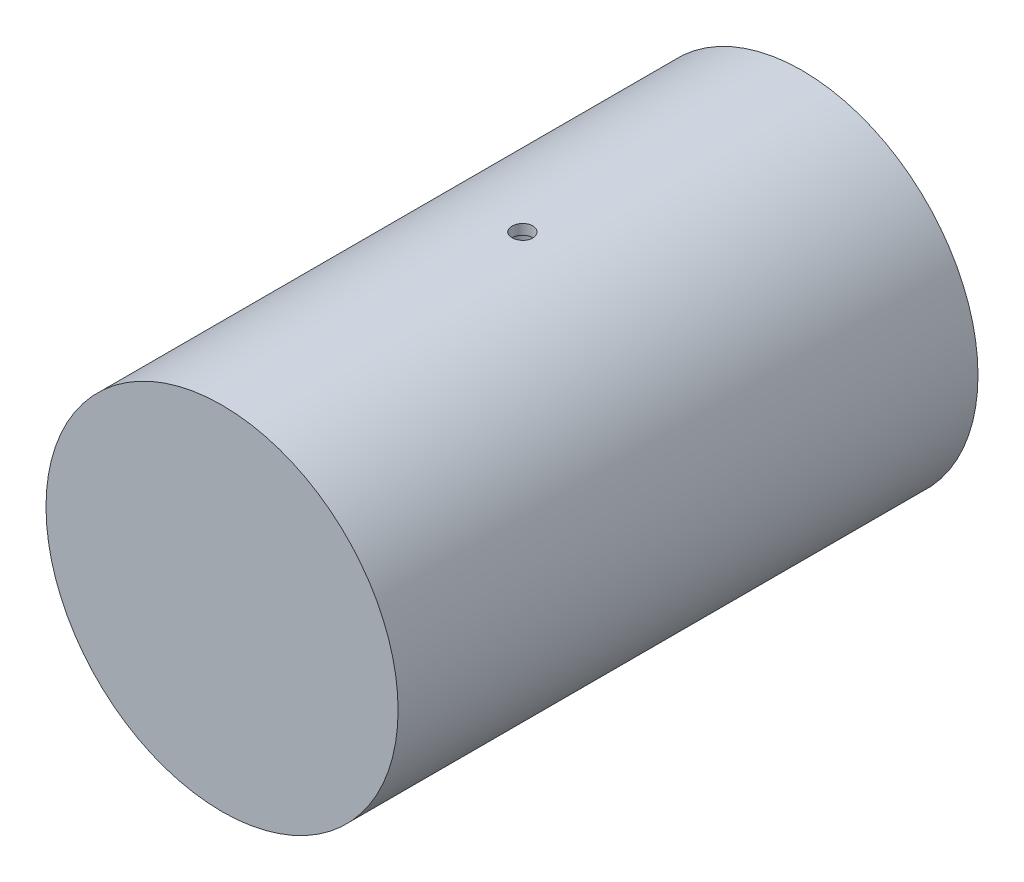
ISO-10303-21;
HEADER;
FILE_DESCRIPTION(('STEP AP214'),'2;1');
FILE_NAME('part.step','',(''),(''),'','','');
FILE_SCHEMA(('AUTOMOTIVE_DESIGN { 1 0 10303 214 1 1 1 1 }'));
ENDSEC;
DATA;
#1=APPLICATION_CONTEXT('core data for automotive mechanical design processes');
#2=APPLICATION_PROTOCOL_DEFINITION('international standard','automotive_design',2000,#1);
#3=PRODUCT_CONTEXT('',#1,'mechanical');
#4=PRODUCT('Part','Part','',(#3));
#5=PRODUCT_RELATED_PRODUCT_CATEGORY('part','',(#4));
#6=PRODUCT_DEFINITION_FORMATION('','',#4);
#7=PRODUCT_DEFINITION_CONTEXT('part definition',#1,'design');
#8=PRODUCT_DEFINITION('design','',#6,#7);
#9=PRODUCT_DEFINITION_SHAPE('','',#8);
#10=(LENGTH_UNIT() NAMED_UNIT(*) SI_UNIT(.MILLI.,.METRE.));
#11=(NAMED_UNIT(*) PLANE_ANGLE_UNIT() SI_UNIT($,.RADIAN.));
#12=(NAMED_UNIT(*) SI_UNIT($,.STERADIAN.) SOLID_ANGLE_UNIT());
#13=UNCERTAINTY_MEASURE_WITH_UNIT(LENGTH_MEASURE(1.E-05),#10,'distance_accuracy_value','');
#14=(GEOMETRIC_REPRESENTATION_CONTEXT(3) GLOBAL_UNCERTAINTY_ASSIGNED_CONTEXT((#13)) GLOBAL_UNIT_ASSIGNED_CONTEXT((#10,
#11,#12)) REPRESENTATION_CONTEXT('',''));
#15=CARTESIAN_POINT('',(0.,0.,0.));
#16=DIRECTION('',(0.,0.,1.));
#17=DIRECTION('',(1.,0.,0.));
#18=AXIS2_PLACEMENT_3D('',#15,#16,#17);
#19=CARTESIAN_POINT('',(0.,0.,-56.));
#20=DIRECTION('',(0.,0.,1.));
#21=DIRECTION('',(1.,0.,0.));
#22=AXIS2_PLACEMENT_3D('',#19,#20,#21);
#23=CYLINDRICAL_SURFACE('',#22,10.);
#24=CARTESIAN_POINT('',(0.,0.,-2.));
#25=DIRECTION('',(0.,0.,1.));
#26=DIRECTION('',(1.,0.,0.));
#27=AXIS2_PLACEMENT_3D('',#24,#25,#26);
#28=CIRCLE('',#27,10.);
#29=CARTESIAN_POINT('',(10.,0.,-2.));
#30=VERTEX_POINT('',#29);
#31=EDGE_CURVE('E225',#30,#30,#28,.T.);
#32=ORIENTED_EDGE('',*,*,#31,.T.);
#33=EDGE_LOOP('',(#32));
#34=FACE_BOUND('',#33,.T.);
#35=CARTESIAN_POINT('',(0.,10.,-27.5));
#36=CARTESIAN_POINT('',(-0.0837515444816424,9.99999865771297,-27.5000034538152));
#37=CARTESIAN_POINT('',(-0.167551685082132,9.9989368253704,-27.5070380008406));
#38=CARTESIAN_POINT('',(-0.332809627994914,9.99480315973187,-27.5349831999828));
#39=CARTESIAN_POINT('',(-0.41426506897423,9.99172936938473,-27.5559073629449));
#40=CARTESIAN_POINT('',(-0.572418086221861,9.98391721219526,-27.6109925049676));
#41=CARTESIAN_POINT('',(-0.649119207826801,9.97918010370919,-27.645143479506));
#42=CARTESIAN_POINT('',(-0.795690428635256,9.96856475911724,-27.7256883794169));
#43=CARTESIAN_POINT('',(-0.86556147472519,9.96268668152773,-27.7720806044174));
#44=CARTESIAN_POINT('',(-0.997046719562127,9.95039170991452,-27.8761772649399));
#45=CARTESIAN_POINT('',(-1.0585998322255,9.94397133890331,-27.9339584562082));
#46=CARTESIAN_POINT('',(-1.17117490668949,9.93134261133238,-28.0590276888939));
#47=CARTESIAN_POINT('',(-1.22219626272936,9.92513426698505,-28.1263162767785));
#48=CARTESIAN_POINT('',(-1.31249729499943,9.91359877458726,-28.2689006435225));
#49=CARTESIAN_POINT('',(-1.35171787037205,9.90827611975031,-28.3442342469813));
#50=CARTESIAN_POINT('',(-1.41692632171056,9.89916211306268,-28.5005128206454));
#51=CARTESIAN_POINT('',(-1.44291491889163,9.89537067775448,-28.5814574847439));
#52=CARTESIAN_POINT('',(-1.48073198798911,9.88978256218673,-28.7460180418717));
#53=CARTESIAN_POINT('',(-1.49266503640518,9.8879711574125,-28.829609393408));
#54=CARTESIAN_POINT('',(-1.50235624033933,9.88650348970582,-28.9976261659873));
#55=CARTESIAN_POINT('',(-1.50011520973796,9.88684710303147,-29.0820515388625));
#56=CARTESIAN_POINT('',(-1.48160733250788,9.88963718352409,-29.2486010801941));
#57=CARTESIAN_POINT('',(-1.4654569592775,9.89206618761549,-29.3307385264848));
#58=CARTESIAN_POINT('',(-1.41977117403734,9.89872608126367,-29.4911243688715));
#59=CARTESIAN_POINT('',(-1.39023538337812,9.90295702179379,-29.5693726548807));
#60=CARTESIAN_POINT('',(-1.31849603529737,9.91276335545481,-29.7201133712829));
#61=CARTESIAN_POINT('',(-1.27624314283198,9.91834396766526,-29.7925819690924));
#62=CARTESIAN_POINT('',(-1.18030413128955,9.93021707574548,-29.9294445957819));
#63=CARTESIAN_POINT('',(-1.12661726182478,9.93650961832501,-29.9938380942694));
#64=CARTESIAN_POINT('',(-1.00869493078248,9.94917473056209,-30.1133976607397));
#65=CARTESIAN_POINT('',(-0.944359329642003,9.95554747112815,-30.1684649902863));
#66=CARTESIAN_POINT('',(-0.807307089894186,9.96759647648462,-30.2670359345073));
#67=CARTESIAN_POINT('',(-0.73459041458817,9.9732727382251,-30.3105394985439));
#68=CARTESIAN_POINT('',(-0.582754598213685,9.98329515585393,-30.3847530864995));
#69=CARTESIAN_POINT('',(-0.503631677836779,9.98764051925428,-30.4154554918403));
#70=CARTESIAN_POINT('',(-0.34127318248706,9.99450490557069,-30.4631093896854));
#71=CARTESIAN_POINT('',(-0.2580378859526,9.99702405195467,-30.4800618118156));
#72=CARTESIAN_POINT('',(-0.0906695676436457,9.99993581133871,-30.4996032298167));
#73=CARTESIAN_POINT('',(-0.0065527318704695,10.0003485209039,-30.5023279713793));
#74=CARTESIAN_POINT('',(0.160936677662284,9.99905561015226,-30.493696994689));
#75=CARTESIAN_POINT('',(0.244309274381878,9.99735005541369,-30.4823417123319));
#76=CARTESIAN_POINT('',(0.40753238743141,9.99202468615333,-30.4459858998225));
#77=CARTESIAN_POINT('',(0.48739796307984,9.98841415207984,-30.4210515039692));
#78=CARTESIAN_POINT('',(0.641814958643002,9.97968235658369,-30.3583150025382));
#79=CARTESIAN_POINT('',(0.716366128795101,9.97456102421565,-30.3205122926664));
#80=CARTESIAN_POINT('',(0.858634979291923,9.96332682468686,-30.2327937754361));
#81=CARTESIAN_POINT('',(0.926299009891568,9.95720701626745,-30.1827918599872));
#82=CARTESIAN_POINT('',(1.05232367317771,9.94467863012165,-30.0722141883713));
#83=CARTESIAN_POINT('',(1.11068376479341,9.93827003562867,-30.0116378176753));
#84=CARTESIAN_POINT('',(1.21693784957196,9.92582264304494,-29.8810264668235));
#85=CARTESIAN_POINT('',(1.26474084747421,9.91978736017588,-29.8109170748052));
#86=CARTESIAN_POINT('',(1.34789129270584,9.90883219104903,-29.6635839594882));
#87=CARTESIAN_POINT('',(1.38323907656436,9.90391227465628,-29.5863604284785));
#88=CARTESIAN_POINT('',(1.44033467323943,9.89577033008645,-29.4272624663769));
#89=CARTESIAN_POINT('',(1.46213037141635,9.89254233006438,-29.3454055390288));
#90=CARTESIAN_POINT('',(1.49165549501586,9.88813382297802,-29.1791409845649));
#91=CARTESIAN_POINT('',(1.49938589183067,9.88695317451771,-29.0947335340053));
#92=CARTESIAN_POINT('',(1.5005378666944,9.88677832610841,-28.9266709366842));
#93=CARTESIAN_POINT('',(1.49410252167313,9.88776226333502,-28.8430167582431));
#94=CARTESIAN_POINT('',(1.46741229544379,9.89175820611174,-28.6779947366765));
#95=CARTESIAN_POINT('',(1.44715743638627,9.89477020841117,-28.5966268898866));
#96=CARTESIAN_POINT('',(1.39345373518665,9.90247526112297,-28.4385269177657));
#97=CARTESIAN_POINT('',(1.36001489324314,9.90716703716075,-28.3617913295666));
#98=CARTESIAN_POINT('',(1.28090667642309,9.91770454557702,-28.2149963661976));
#99=CARTESIAN_POINT('',(1.23523688741502,9.92355031702724,-28.1449372171964));
#100=CARTESIAN_POINT('',(1.13244337659164,9.93580743364938,-28.0127569420248));
#101=CARTESIAN_POINT('',(1.07521369039806,9.94222367881967,-27.9507186667529));
#102=CARTESIAN_POINT('',(0.951148841082837,9.95485788826636,-27.8370754452122));
#103=CARTESIAN_POINT('',(0.884311448350943,9.96107580610759,-27.7854729274238));
#104=CARTESIAN_POINT('',(0.742495707543723,9.9726518579052,-27.6939123233926));
#105=CARTESIAN_POINT('',(0.667474576764761,9.9780050712882,-27.6540198907853));
#106=CARTESIAN_POINT('',(0.51175187024872,9.98720028802959,-27.587461483242));
#107=CARTESIAN_POINT('',(0.431056277096705,9.99104385565757,-27.5607818099463));
#108=CARTESIAN_POINT('',(0.29166572788933,9.99590939261505,-27.5274586572899));
#109=CARTESIAN_POINT('',(0.233831133495279,9.99743549179557,-27.5171773984612));
#110=CARTESIAN_POINT('',(0.117338971600125,9.99948125947896,-27.5034469022874));
#111=CARTESIAN_POINT('',(0.0586814143344172,10.0000009404877,-27.4999975800475));
#112=CARTESIAN_POINT('',(0.,10.,-27.5));
#113=B_SPLINE_CURVE_WITH_KNOTS('',3,(#35,#36,#37,#38,#39,#40,#41,#42,#43,#44,#45,#46,#47,#48,
#49,#50,#51,#52,#53,#54,#55,#56,#57,#58,#59,#60,#61,#62,#63,#64,#65,#66,#67,#68,#69,#70,#71,#72,
#73,#74,#75,#76,#77,#78,#79,#80,#81,#82,#83,#84,#85,#86,#87,#88,#89,#90,#91,#92,#93,#94,#95,#96,
#97,#98,#99,#100,#101,#102,#103,#104,#105,#106,#107,#108,#109,#110,#111,#112),.UNSPECIFIED.,.T.,
.F.,(4,2,2,2,2,2,2,2,2,2,2,2,2,2,2,2,2,2,2,2,2,2,2,2,2,2,2,2,2,2,2,2,2,2,2,2,2,2,4),(0.,
0.251040205031664,0.502324962929151,0.753420023583239,1.0044802241976,1.25729416136843,
1.5101226357258,1.76419702395375,2.01825756225506,2.27041564605925,2.52255925098983,
2.77261177195747,3.02267136690361,3.27371383476159,3.52477278308535,3.77834291255409,
4.03191415238669,4.28563608984875,4.53934087193402,4.79062058544256,5.04189251991155,
5.29195148965949,5.54202220376274,5.79391188036908,6.0458162002863,6.29981366584672,
6.55380426808833,6.80689223457168,7.05996272137177,7.31048888261065,7.56101464229565,
7.81135073984148,8.06169531466881,8.31444829965721,8.56726003468734,8.82146323384734,
9.07540233261442,9.25129851978809,9.42719252123292),.UNSPECIFIED.);
#114=CARTESIAN_POINT('',(0.,10.,-27.5));
#115=VERTEX_POINT('',#114);
#116=EDGE_CURVE('E149',#115,#115,#113,.T.);
#117=ORIENTED_EDGE('',*,*,#116,.F.);
#118=EDGE_LOOP('',(#117));
#119=FACE_BOUND('',#118,.T.);
#120=CARTESIAN_POINT('',(0.,0.,-54.));
#121=DIRECTION('',(0.,0.,-1.));
#122=DIRECTION('',(-1.,0.,0.));
#123=AXIS2_PLACEMENT_3D('',#120,#121,#122);
#124=CIRCLE('',#123,10.);
#125=CARTESIAN_POINT('',(-10.,0.,-54.));
#126=VERTEX_POINT('',#125);
#127=EDGE_CURVE('E52',#126,#126,#124,.F.);
#128=ORIENTED_EDGE('',*,*,#127,.F.);
#129=EDGE_LOOP('',(#128));
#130=FACE_BOUND('',#129,.T.);
#131=ADVANCED_FACE('F39',(#34,#119,#130),#23,.F.);
#132=CARTESIAN_POINT('',(0.,0.,-2.));
#133=DIRECTION('',(0.,0.,1.));
#134=DIRECTION('',(1.,0.,0.));
#135=AXIS2_PLACEMENT_3D('',#132,#133,#134);
#136=PLANE('',#135);
#137=ORIENTED_EDGE('',*,*,#31,.F.);
#138=EDGE_LOOP('',(#137));
#139=FACE_BOUND('',#138,.T.);
#140=ADVANCED_FACE('F170',(#139),#136,.F.);
#141=CARTESIAN_POINT('',(0.,16.,0.));
#142=DIRECTION('',(0.,1.,0.));
#143=DIRECTION('',(0.,0.,1.));
#144=AXIS2_PLACEMENT_3D('',#141,#142,#143);
#145=PLANE('',#144);
#146=CARTESIAN_POINT('',(0.,16.,-29.));
#147=DIRECTION('',(0.,1.,0.));
#148=DIRECTION('',(0.,0.,1.));
#149=AXIS2_PLACEMENT_3D('',#146,#147,#148);
#150=CIRCLE('',#149,1.);
#151=CARTESIAN_POINT('',(0.,16.,-28.));
#152=VERTEX_POINT('',#151);
#153=EDGE_CURVE('E115',#152,#152,#150,.F.);
#154=ORIENTED_EDGE('',*,*,#153,.F.);
#155=EDGE_LOOP('',(#154));
#156=FACE_BOUND('',#155,.T.);
#157=CARTESIAN_POINT('',(0.,16.,-29.));
#158=DIRECTION('',(0.,1.,0.));
#159=DIRECTION('',(0.,0.,1.));
#160=AXIS2_PLACEMENT_3D('',#157,#158,#159);
#161=CIRCLE('',#160,1.5);
#162=CARTESIAN_POINT('',(0.,16.,-27.5));
#163=VERTEX_POINT('',#162);
#164=EDGE_CURVE('E160',#163,#163,#161,.T.);
#165=ORIENTED_EDGE('',*,*,#164,.F.);
#166=EDGE_LOOP('',(#165));
#167=FACE_BOUND('',#166,.T.);
#168=ADVANCED_FACE('F167',(#156,#167),#145,.F.);
#169=CARTESIAN_POINT('',(0.,-17.001,-29.));
#170=DIRECTION('',(0.,1.,0.));
#171=DIRECTION('',(0.,0.,1.));
#172=AXIS2_PLACEMENT_3D('',#169,#170,#171);
#173=CYLINDRICAL_SURFACE('',#172,1.5);
#174=ORIENTED_EDGE('',*,*,#164,.T.);
#175=EDGE_LOOP('',(#174));
#176=FACE_BOUND('',#175,.T.);
#177=ORIENTED_EDGE('',*,*,#116,.T.);
#178=EDGE_LOOP('',(#177));
#179=FACE_BOUND('',#178,.T.);
#180=ADVANCED_FACE('F162',(#176,#179),#173,.F.);
#181=CARTESIAN_POINT('',(0.,0.,-54.));
#182=DIRECTION('',(0.,0.,-1.));
#183=DIRECTION('',(-1.,0.,0.));
#184=AXIS2_PLACEMENT_3D('',#181,#182,#183);
#185=CYLINDRICAL_SURFACE('',#184,5.);
#186=CARTESIAN_POINT('',(0.,0.,-54.));
#187=DIRECTION('',(0.,0.,-1.));
#188=DIRECTION('',(-1.,0.,0.));
#189=AXIS2_PLACEMENT_3D('',#186,#187,#188);
#190=CIRCLE('',#189,5.);
#191=CARTESIAN_POINT('',(-5.,0.,-54.));
#192=VERTEX_POINT('',#191);
#193=EDGE_CURVE('E146',#192,#192,#190,.T.);
#194=ORIENTED_EDGE('',*,*,#193,.F.);
#195=EDGE_LOOP('',(#194));
#196=FACE_BOUND('',#195,.T.);
#197=CARTESIAN_POINT('',(0.,0.,-55.));
#198=DIRECTION('',(0.,0.,-1.));
#199=DIRECTION('',(-1.,0.,0.));
#200=AXIS2_PLACEMENT_3D('',#197,#198,#199);
#201=CIRCLE('',#200,5.);
#202=CARTESIAN_POINT('',(-2.26420311297507,-4.45795740930687,-55.));
#203=VERTEX_POINT('',#202);
#204=CARTESIAN_POINT('',(-4.78340576371954,-1.45568859980928,-55.));
#205=VERTEX_POINT('',#204);
#206=EDGE_CURVE('E99',#203,#205,#201,.T.);
#207=ORIENTED_EDGE('',*,*,#206,.T.);
#208=DIRECTION('',(0.,0.,-1.));
#209=VECTOR('',#208,1.);
#210=CARTESIAN_POINT('',(-4.78340576371954,-1.45568859980928,-55.));
#211=LINE('',#210,#209);
#212=CARTESIAN_POINT('',(-4.78340576371954,-1.45568859980928,-56.));
#213=VERTEX_POINT('',#212);
#214=EDGE_CURVE('E107',#205,#213,#211,.T.);
#215=ORIENTED_EDGE('',*,*,#214,.T.);
#216=CARTESIAN_POINT('',(0.,0.,-56.));
#217=DIRECTION('',(0.,0.,-1.));
#218=DIRECTION('',(-1.,0.,0.));
#219=AXIS2_PLACEMENT_3D('',#216,#217,#218);
#220=CIRCLE('',#219,5.);
#221=CARTESIAN_POINT('',(-1.95959179422654,4.6,-56.));
#222=VERTEX_POINT('',#221);
#223=EDGE_CURVE('E145',#213,#222,#220,.T.);
#224=ORIENTED_EDGE('',*,*,#223,.T.);
#225=DIRECTION('',(0.,0.,-1.));
#226=VECTOR('',#225,1.);
#227=CARTESIAN_POINT('',(-1.95959179422654,4.6,-55.));
#228=LINE('',#227,#226);
#229=CARTESIAN_POINT('',(-1.95959179422654,4.6,-55.));
#230=VERTEX_POINT('',#229);
#231=EDGE_CURVE('E138',#230,#222,#228,.T.);
#232=ORIENTED_EDGE('',*,*,#231,.F.);
#233=CARTESIAN_POINT('',(0.,0.,-55.));
#234=DIRECTION('',(0.,0.,-1.));
#235=DIRECTION('',(-1.,0.,0.));
#236=AXIS2_PLACEMENT_3D('',#233,#234,#235);
#237=CIRCLE('',#236,5.);
#238=CARTESIAN_POINT('',(1.95959179422654,4.6,-55.));
#239=VERTEX_POINT('',#238);
#240=EDGE_CURVE('E131',#230,#239,#237,.T.);
#241=ORIENTED_EDGE('',*,*,#240,.T.);
#242=DIRECTION('',(0.,0.,-1.));
#243=VECTOR('',#242,1.);
#244=CARTESIAN_POINT('',(1.95959179422654,4.6,-55.));
#245=LINE('',#244,#243);
#246=CARTESIAN_POINT('',(1.95959179422654,4.6,-56.));
#247=VERTEX_POINT('',#246);
#248=EDGE_CURVE('E127',#239,#247,#245,.T.);
#249=ORIENTED_EDGE('',*,*,#248,.T.);
#250=CARTESIAN_POINT('',(4.78340576371954,-1.45568859980928,-56.));
#251=VERTEX_POINT('',#250);
#252=EDGE_CURVE('E150',#247,#251,#220,.T.);
#253=ORIENTED_EDGE('',*,*,#252,.T.);
#254=DIRECTION('',(0.,0.,-1.));
#255=VECTOR('',#254,1.);
#256=CARTESIAN_POINT('',(4.78340576371954,-1.45568859980928,-55.));
#257=LINE('',#256,#255);
#258=CARTESIAN_POINT('',(4.78340576371954,-1.45568859980928,-55.));
#259=VERTEX_POINT('',#258);
#260=EDGE_CURVE('E67',#259,#251,#257,.T.);
#261=ORIENTED_EDGE('',*,*,#260,.F.);
#262=CARTESIAN_POINT('',(0.,0.,-55.));
#263=DIRECTION('',(0.,0.,-1.));
#264=DIRECTION('',(-1.,0.,0.));
#265=AXIS2_PLACEMENT_3D('',#262,#263,#264);
#266=CIRCLE('',#265,5.);
#267=CARTESIAN_POINT('',(2.26420311297507,-4.45795740930687,-55.));
#268=VERTEX_POINT('',#267);
#269=EDGE_CURVE('E119',#259,#268,#266,.T.);
#270=ORIENTED_EDGE('',*,*,#269,.T.);
#271=DIRECTION('',(0.,0.,-1.));
#272=VECTOR('',#271,1.);
#273=CARTESIAN_POINT('',(2.26420311297507,-4.45795740930687,-55.));
#274=LINE('',#273,#272);
#275=CARTESIAN_POINT('',(2.26420311297507,-4.45795740930687,-56.));
#276=VERTEX_POINT('',#275);
#277=EDGE_CURVE('E128',#268,#276,#274,.T.);
#278=ORIENTED_EDGE('',*,*,#277,.T.);
#279=CARTESIAN_POINT('',(-2.26420311297507,-4.45795740930687,-56.));
#280=VERTEX_POINT('',#279);
#281=EDGE_CURVE('E113',#276,#280,#220,.T.);
#282=ORIENTED_EDGE('',*,*,#281,.T.);
#283=DIRECTION('',(0.,0.,-1.));
#284=VECTOR('',#283,1.);
#285=CARTESIAN_POINT('',(-2.26420311297507,-4.45795740930687,-55.));
#286=LINE('',#285,#284);
#287=EDGE_CURVE('E59',#203,#280,#286,.T.);
#288=ORIENTED_EDGE('',*,*,#287,.F.);
#289=EDGE_LOOP('',(#207,#215,#224,#232,#241,#249,#253,#261,#270,#278,#282,#288));
#290=FACE_BOUND('',#289,.T.);
#291=ADVANCED_FACE('F110',(#196,#290),#185,.F.);
#292=CARTESIAN_POINT('',(0.,0.,-54.));
#293=DIRECTION('',(0.,0.,-1.));
#294=DIRECTION('',(-1.,0.,0.));
#295=AXIS2_PLACEMENT_3D('',#292,#293,#294);
#296=PLANE('',#295);
#297=ORIENTED_EDGE('',*,*,#193,.T.);
#298=EDGE_LOOP('',(#297));
#299=FACE_BOUND('',#298,.T.);
#300=ORIENTED_EDGE('',*,*,#127,.T.);
#301=EDGE_LOOP('',(#300));
#302=FACE_BOUND('',#301,.T.);
#303=ADVANCED_FACE('F174',(#299,#302),#296,.F.);
#304=CARTESIAN_POINT('',(0.,0.,0.));
#305=DIRECTION('',(0.,0.,1.));
#306=DIRECTION('',(1.,0.,0.));
#307=AXIS2_PLACEMENT_3D('',#304,#305,#306);
#308=PLANE('',#307);
#309=CARTESIAN_POINT('',(0.,0.,0.));
#310=DIRECTION('',(0.,0.,1.));
#311=DIRECTION('',(1.,0.,0.));
#312=AXIS2_PLACEMENT_3D('',#309,#310,#311);
#313=CIRCLE('',#312,17.);
#314=CARTESIAN_POINT('',(17.,0.,0.));
#315=VERTEX_POINT('',#314);
#316=EDGE_CURVE('E223',#315,#315,#313,.T.);
#317=ORIENTED_EDGE('',*,*,#316,.T.);
#318=EDGE_LOOP('',(#317));
#319=FACE_BOUND('',#318,.T.);
#320=ADVANCED_FACE('F177',(#319),#308,.T.);
#321=CARTESIAN_POINT('',(0.,0.,-2.));
#322=DIRECTION('',(0.,0.,1.));
#323=DIRECTION('',(1.,0.,0.));
#324=AXIS2_PLACEMENT_3D('',#321,#322,#323);
#325=CYLINDRICAL_SURFACE('',#324,17.);
#326=CARTESIAN_POINT('',(0.,17.,-28.));
#327=CARTESIAN_POINT('',(0.0561183746501264,16.9999996082067,-28.0000024716357));
#328=CARTESIAN_POINT('',(0.112276202860598,16.9997191499508,-28.0047397791588));
#329=CARTESIAN_POINT('',(0.223041674009741,16.9986273089947,-28.023570099752));
#330=CARTESIAN_POINT('',(0.277647427794243,16.99781530595,-28.0376740445267));
#331=CARTESIAN_POINT('',(0.38368824240781,16.995752249275,-28.0748315492316));
#332=CARTESIAN_POINT('',(0.435124941635176,16.9945014247927,-28.0978804388714));
#333=CARTESIAN_POINT('',(0.533385723026011,16.9917014683063,-28.1522661123082));
#334=CARTESIAN_POINT('',(0.580210868421177,16.9901524053082,-28.1836009795363));
#335=CARTESIAN_POINT('',(0.667995846390313,16.9869278107431,-28.253715430904));
#336=CARTESIAN_POINT('',(0.708948680843567,16.9852521318566,-28.2925037707974));
#337=CARTESIAN_POINT('',(0.7837667438938,16.981964425654,-28.3764062019085));
#338=CARTESIAN_POINT('',(0.81763167845635,16.9803524009807,-28.4215205554249));
#339=CARTESIAN_POINT('',(0.87733364496531,16.9773726782667,-28.516833291706));
#340=CARTESIAN_POINT('',(0.90316494942709,16.9760051548342,-28.5670352679796));
#341=CARTESIAN_POINT('',(0.946029728558036,16.9736705291336,-28.6710729792676));
#342=CARTESIAN_POINT('',(0.963063288989445,16.9727034229622,-28.7249086788539));
#343=CARTESIAN_POINT('',(0.987829865943245,16.9712800777172,-28.8346189583736));
#344=CARTESIAN_POINT('',(0.995573725716119,16.9708232430806,-28.8904910826436));
#345=CARTESIAN_POINT('',(1.00157454952996,16.9704701732292,-29.0027439105296));
#346=CARTESIAN_POINT('',(0.999831610675698,16.9705739322763,-29.0591246089339));
#347=CARTESIAN_POINT('',(0.986917320304146,16.9713297958248,-29.1707203170552));
#348=CARTESIAN_POINT('',(0.975757696579302,16.9719812182477,-29.2259366892192));
#349=CARTESIAN_POINT('',(0.94434500290671,16.9737579197931,-29.3337110780658));
#350=CARTESIAN_POINT('',(0.924091883555518,16.9748832014898,-29.3862690803043));
#351=CARTESIAN_POINT('',(0.875053770991126,16.9774815896434,-29.4872725128612));
#352=CARTESIAN_POINT('',(0.846263449215765,16.9789549132162,-29.5357153503011));
#353=CARTESIAN_POINT('',(0.78097205059819,16.9820831249695,-29.6270849885991));
#354=CARTESIAN_POINT('',(0.744470897297473,16.9837380149503,-29.6700117347543));
#355=CARTESIAN_POINT('',(0.664727875730669,16.9870458854863,-29.7491988998026));
#356=CARTESIAN_POINT('',(0.621475855871977,16.9886988593262,-29.7854490969132));
#357=CARTESIAN_POINT('',(0.529494483315231,16.9918141927135,-29.8501753337895));
#358=CARTESIAN_POINT('',(0.480765128899694,16.9932765522012,-29.8786513711176));
#359=CARTESIAN_POINT('',(0.379206204412818,16.9958459622978,-29.9270200568789));
#360=CARTESIAN_POINT('',(0.326376454135523,16.9969529972799,-29.9469123278169));
#361=CARTESIAN_POINT('',(0.218119112458328,16.9986867904689,-29.9775420306861));
#362=CARTESIAN_POINT('',(0.162691547948043,16.999313553646,-29.9882795573548));
#363=CARTESIAN_POINT('',(0.050900666474477,17.0000155334865,-30.0002823282654));
#364=CARTESIAN_POINT('',(-0.005461127958274,17.0000915731607,-30.0015617069878));
#365=CARTESIAN_POINT('',(-0.1175985454968,16.9996857248861,-29.9946487821063));
#366=CARTESIAN_POINT('',(-0.173374171298664,16.9992038395046,-29.9864565220866));
#367=CARTESIAN_POINT('',(-0.282716235495461,16.9977369278617,-29.9608445697599));
#368=CARTESIAN_POINT('',(-0.336284195719763,16.9967522546801,-29.9434313524977));
#369=CARTESIAN_POINT('',(-0.439737273498814,16.9943905722397,-29.8998783554226));
#370=CARTESIAN_POINT('',(-0.489622361686738,16.9930135598529,-29.8737385060336));
#371=CARTESIAN_POINT('',(-0.584358423026641,16.9900199316599,-29.8134382121784));
#372=CARTESIAN_POINT('',(-0.629203371432839,16.9884030343495,-29.7792683165885));
#373=CARTESIAN_POINT('',(-0.712525543101089,16.9851125847618,-29.7038916612643));
#374=CARTESIAN_POINT('',(-0.751002710614035,16.9834390319887,-29.662684839929));
#375=CARTESIAN_POINT('',(-0.820544882253057,16.9802215212302,-29.574343117712));
#376=CARTESIAN_POINT('',(-0.851600724421362,16.978677724943,-29.5272009978921));
#377=CARTESIAN_POINT('',(-0.905356030704418,16.9758963846561,-29.4283632127282));
#378=CARTESIAN_POINT('',(-0.928055541566714,16.9746588389431,-29.3766675728599));
#379=CARTESIAN_POINT('',(-0.964437928879209,16.9726307209231,-29.270223813434));
#380=CARTESIAN_POINT('',(-0.97812659534078,16.9718398616394,-29.2154776785844));
#381=CARTESIAN_POINT('',(-0.996117641244239,16.9707935026047,-29.1044593375797));
#382=CARTESIAN_POINT('',(-1.00042010116884,16.9705379982633,-29.0481871445141));
#383=CARTESIAN_POINT('',(-0.999515838122645,16.9705912734493,-28.935805174045));
#384=CARTESIAN_POINT('',(-0.994323521596244,16.9708991980853,-28.8796952797475));
#385=CARTESIAN_POINT('',(-0.974606937601246,16.9720428201189,-28.7691454304075));
#386=CARTESIAN_POINT('',(-0.96008265292127,16.9728785184899,-28.7147054784451));
#387=CARTESIAN_POINT('',(-0.922117583314701,16.9749833032909,-28.6090384526631));
#388=CARTESIAN_POINT('',(-0.898676815664675,16.9762523888812,-28.5578113726184));
#389=CARTESIAN_POINT('',(-0.843546281111595,16.9790808989316,-28.4600182342922));
#390=CARTESIAN_POINT('',(-0.811856740354144,16.9806403154317,-28.4134520482776));
#391=CARTESIAN_POINT('',(-0.741075329876088,16.9838764922282,-28.3262297411644));
#392=CARTESIAN_POINT('',(-0.701973132288073,16.9855534141621,-28.2855820074944));
#393=CARTESIAN_POINT('',(-0.617488612819354,16.9888343021954,-28.2114140992484));
#394=CARTESIAN_POINT('',(-0.572104754109951,16.9904382503136,-28.1778956739867));
#395=CARTESIAN_POINT('',(-0.476298644798581,16.9933939396066,-28.1189160450468));
#396=CARTESIAN_POINT('',(-0.425870669756793,16.9947453891248,-28.0934641355258));
#397=CARTESIAN_POINT('',(-0.321486229260541,16.9970397610062,-28.0514192433704));
#398=CARTESIAN_POINT('',(-0.267533991546778,16.9979831628725,-28.0348158573422));
#399=CARTESIAN_POINT('',(-0.177708363856153,16.9991071850645,-28.0152672896781));
#400=CARTESIAN_POINT('',(-0.142415986844461,16.9994405079764,-28.0095494294173));
#401=CARTESIAN_POINT('',(-0.0714210672826123,16.9998870399963,-28.0019150002994));
#402=CARTESIAN_POINT('',(-0.0357185252291029,17.0000002493707,-27.99999842684));
#403=CARTESIAN_POINT('',(0.,17.,-28.));
#404=B_SPLINE_CURVE_WITH_KNOTS('',3,(#326,#327,#328,#329,#330,#331,#332,#333,#334,#335,#336,
#337,#338,#339,#340,#341,#342,#343,#344,#345,#346,#347,#348,#349,#350,#351,#352,#353,#354,#355,
#356,#357,#358,#359,#360,#361,#362,#363,#364,#365,#366,#367,#368,#369,#370,#371,#372,#373,#374,
#375,#376,#377,#378,#379,#380,#381,#382,#383,#384,#385,#386,#387,#388,#389,#390,#391,#392,#393,
#394,#395,#396,#397,#398,#399,#400,#401,#402,#403),.UNSPECIFIED.,.T.,.F.,(4,2,2,2,2,2,2,2,2,2,2,
2,2,2,2,2,2,2,2,2,2,2,2,2,2,2,2,2,2,2,2,2,2,2,2,2,2,2,4),(0.,0.168224732642648,
0.336646144457545,0.504979738968159,0.673274431475586,0.841768045505397,1.01026864793928,
1.17888910701349,1.34750792230927,1.51592972796072,1.68434980968695,1.85256044557549,
2.02077199533541,2.18908875744697,2.35740718861998,2.52598121089487,2.69455528602827,
2.86313677392696,3.03171651724715,3.20004427997714,3.36837126814283,3.5365802119171,
3.7047904968266,3.87319976059687,4.04161049869066,4.21022808551262,4.37884472902851,
4.54735292013826,4.71585966635655,4.88411094904949,5.05236254205688,5.22061380906182,
5.38886046383207,5.55734327857491,5.72586738628295,5.89458496572892,6.06310374031495,
6.17017645347565,6.27724903700141),.UNSPECIFIED.);
#405=CARTESIAN_POINT('',(0.,17.,-28.));
#406=VERTEX_POINT('',#405);
#407=EDGE_CURVE('E11',#406,#406,#404,.T.);
#408=ORIENTED_EDGE('',*,*,#407,.F.);
#409=EDGE_LOOP('',(#408));
#410=FACE_BOUND('',#409,.T.);
#411=ORIENTED_EDGE('',*,*,#316,.F.);
#412=EDGE_LOOP('',(#411));
#413=FACE_BOUND('',#412,.T.);
#414=CARTESIAN_POINT('',(0.,0.,-56.));
#415=DIRECTION('',(0.,0.,1.));
#416=DIRECTION('',(1.,0.,0.));
#417=AXIS2_PLACEMENT_3D('',#414,#415,#416);
#418=CIRCLE('',#417,17.);
#419=CARTESIAN_POINT('',(17.,0.,-56.));
#420=VERTEX_POINT('',#419);
#421=EDGE_CURVE('E226',#420,#420,#418,.T.);
#422=ORIENTED_EDGE('',*,*,#421,.T.);
#423=EDGE_LOOP('',(#422));
#424=FACE_BOUND('',#423,.T.);
#425=ADVANCED_FACE('F41',(#410,#413,#424),#325,.T.);
#426=CARTESIAN_POINT('',(0.,0.,-56.));
#427=DIRECTION('',(0.,0.,1.));
#428=DIRECTION('',(1.,0.,0.));
#429=AXIS2_PLACEMENT_3D('',#426,#427,#428);
#430=PLANE('',#429);
#431=ORIENTED_EDGE('',*,*,#421,.F.);
#432=EDGE_LOOP('',(#431));
#433=FACE_BOUND('',#432,.T.);
#434=ORIENTED_EDGE('',*,*,#223,.F.);
#435=CARTESIAN_POINT('',(-3.83022221559489,-3.21393804843269,-56.));
#436=DIRECTION('',(0.,0.,-1.));
#437=DIRECTION('',(-1.,0.,0.));
#438=AXIS2_PLACEMENT_3D('',#435,#436,#437);
#439=CIRCLE('',#438,2.);
#440=EDGE_CURVE('E104',#280,#213,#439,.T.);
#441=ORIENTED_EDGE('',*,*,#440,.F.);
#442=ORIENTED_EDGE('',*,*,#281,.F.);
#443=CARTESIAN_POINT('',(3.83022221559489,-3.21393804843269,-56.));
#444=DIRECTION('',(0.,0.,-1.));
#445=DIRECTION('',(-1.,0.,0.));
#446=AXIS2_PLACEMENT_3D('',#443,#444,#445);
#447=CIRCLE('',#446,2.);
#448=EDGE_CURVE('E123',#251,#276,#447,.T.);
#449=ORIENTED_EDGE('',*,*,#448,.F.);
#450=ORIENTED_EDGE('',*,*,#252,.F.);
#451=CARTESIAN_POINT('',(0.,5.,-56.));
#452=DIRECTION('',(0.,0.,-1.));
#453=DIRECTION('',(-1.,0.,0.));
#454=AXIS2_PLACEMENT_3D('',#451,#452,#453);
#455=CIRCLE('',#454,2.);
#456=EDGE_CURVE('E135',#222,#247,#455,.T.);
#457=ORIENTED_EDGE('',*,*,#456,.F.);
#458=EDGE_LOOP('',(#434,#441,#442,#449,#450,#457));
#459=FACE_BOUND('',#458,.T.);
#460=ADVANCED_FACE('F184',(#433,#459),#430,.F.);
#461=CARTESIAN_POINT('',(0.,13.1715728752538,-29.));
#462=DIRECTION('',(0.,1.,0.));
#463=DIRECTION('',(0.,0.,1.));
#464=AXIS2_PLACEMENT_3D('',#461,#462,#463);
#465=CYLINDRICAL_SURFACE('',#464,1.);
#466=ORIENTED_EDGE('',*,*,#407,.T.);
#467=EDGE_LOOP('',(#466));
#468=FACE_BOUND('',#467,.T.);
#469=ORIENTED_EDGE('',*,*,#153,.T.);
#470=EDGE_LOOP('',(#469));
#471=FACE_BOUND('',#470,.T.);
#472=ADVANCED_FACE('F179',(#468,#471),#465,.F.);
#473=CARTESIAN_POINT('',(0.,5.,-55.));
#474=DIRECTION('',(0.,0.,-1.));
#475=DIRECTION('',(-1.,0.,0.));
#476=AXIS2_PLACEMENT_3D('',#473,#474,#475);
#477=CYLINDRICAL_SURFACE('',#476,2.);
#478=ORIENTED_EDGE('',*,*,#456,.T.);
#479=ORIENTED_EDGE('',*,*,#248,.F.);
#480=CARTESIAN_POINT('',(0.,5.,-55.));
#481=DIRECTION('',(0.,0.,-1.));
#482=DIRECTION('',(-1.,0.,0.));
#483=AXIS2_PLACEMENT_3D('',#480,#481,#482);
#484=CIRCLE('',#483,2.);
#485=EDGE_CURVE('E134',#230,#239,#484,.T.);
#486=ORIENTED_EDGE('',*,*,#485,.F.);
#487=ORIENTED_EDGE('',*,*,#231,.T.);
#488=EDGE_LOOP('',(#478,#479,#486,#487));
#489=FACE_BOUND('',#488,.T.);
#490=ADVANCED_FACE('F183',(#489),#477,.F.);
#491=CARTESIAN_POINT('',(0.,0.,-55.));
#492=DIRECTION('',(0.,0.,-1.));
#493=DIRECTION('',(-1.,0.,0.));
#494=AXIS2_PLACEMENT_3D('',#491,#492,#493);
#495=PLANE('',#494);
#496=ORIENTED_EDGE('',*,*,#240,.F.);
#497=ORIENTED_EDGE('',*,*,#485,.T.);
#498=EDGE_LOOP('',(#496,#497));
#499=FACE_BOUND('',#498,.T.);
#500=ADVANCED_FACE('F188',(#499),#495,.T.);
#501=CARTESIAN_POINT('',(3.83022221559489,-3.21393804843269,-55.));
#502=DIRECTION('',(0.,0.,-1.));
#503=DIRECTION('',(-1.,0.,0.));
#504=AXIS2_PLACEMENT_3D('',#501,#502,#503);
#505=CYLINDRICAL_SURFACE('',#504,2.);
#506=ORIENTED_EDGE('',*,*,#448,.T.);
#507=ORIENTED_EDGE('',*,*,#277,.F.);
#508=CARTESIAN_POINT('',(3.83022221559489,-3.21393804843269,-55.));
#509=DIRECTION('',(0.,0.,-1.));
#510=DIRECTION('',(-1.,0.,0.));
#511=AXIS2_PLACEMENT_3D('',#508,#509,#510);
#512=CIRCLE('',#511,2.);
#513=EDGE_CURVE('E122',#259,#268,#512,.T.);
#514=ORIENTED_EDGE('',*,*,#513,.F.);
#515=ORIENTED_EDGE('',*,*,#260,.T.);
#516=EDGE_LOOP('',(#506,#507,#514,#515));
#517=FACE_BOUND('',#516,.T.);
#518=ADVANCED_FACE('F192',(#517),#505,.F.);
#519=CARTESIAN_POINT('',(0.,0.,-55.));
#520=DIRECTION('',(0.,0.,-1.));
#521=DIRECTION('',(-1.,0.,0.));
#522=AXIS2_PLACEMENT_3D('',#519,#520,#521);
#523=PLANE('',#522);
#524=ORIENTED_EDGE('',*,*,#269,.F.);
#525=ORIENTED_EDGE('',*,*,#513,.T.);
#526=EDGE_LOOP('',(#524,#525));
#527=FACE_BOUND('',#526,.T.);
#528=ADVANCED_FACE('F196',(#527),#523,.T.);
#529=CARTESIAN_POINT('',(-3.83022221559489,-3.21393804843269,-55.));
#530=DIRECTION('',(0.,0.,-1.));
#531=DIRECTION('',(-1.,0.,0.));
#532=AXIS2_PLACEMENT_3D('',#529,#530,#531);
#533=CYLINDRICAL_SURFACE('',#532,2.);
#534=ORIENTED_EDGE('',*,*,#440,.T.);
#535=ORIENTED_EDGE('',*,*,#214,.F.);
#536=CARTESIAN_POINT('',(-3.83022221559489,-3.21393804843269,-55.));
#537=DIRECTION('',(0.,0.,-1.));
#538=DIRECTION('',(-1.,0.,0.));
#539=AXIS2_PLACEMENT_3D('',#536,#537,#538);
#540=CIRCLE('',#539,2.);
#541=EDGE_CURVE('E101',#203,#205,#540,.T.);
#542=ORIENTED_EDGE('',*,*,#541,.F.);
#543=ORIENTED_EDGE('',*,*,#287,.T.);
#544=EDGE_LOOP('',(#534,#535,#542,#543));
#545=FACE_BOUND('',#544,.T.);
#546=ADVANCED_FACE('F106',(#545),#533,.F.);
#547=CARTESIAN_POINT('',(0.,0.,-55.));
#548=DIRECTION('',(0.,0.,-1.));
#549=DIRECTION('',(-1.,0.,0.));
#550=AXIS2_PLACEMENT_3D('',#547,#548,#549);
#551=PLANE('',#550);
#552=ORIENTED_EDGE('',*,*,#206,.F.);
#553=ORIENTED_EDGE('',*,*,#541,.T.);
#554=EDGE_LOOP('',(#552,#553));
#555=FACE_BOUND('',#554,.T.);
#556=ADVANCED_FACE('F100',(#555),#551,.T.);
#557=CLOSED_SHELL('',(#131,#140,#168,#180,#291,#303,#320,#425,#460,#472,#490,#500,#518,#528,
#546,#556));
#558=MANIFOLD_SOLID_BREP('B2',#557);
#559=ADVANCED_BREP_SHAPE_REPRESENTATION('',(#18,#558),#14);
#560=SHAPE_DEFINITION_REPRESENTATION(#9,#559);
ENDSEC;
END-ISO-10303-21;
